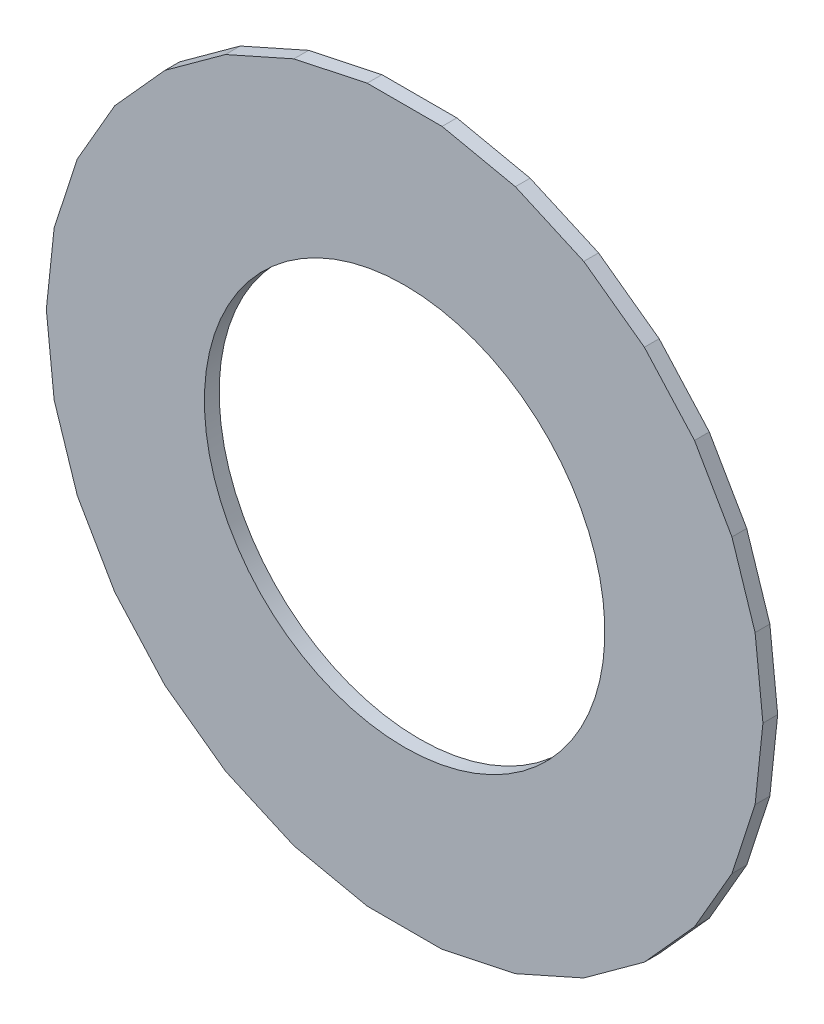
ISO-10303-21;
HEADER;
FILE_DESCRIPTION(('STEP AP214'),'2;1');
FILE_NAME('part.step','',(''),(''),'','','');
FILE_SCHEMA(('AUTOMOTIVE_DESIGN { 1 0 10303 214 1 1 1 1 }'));
ENDSEC;
DATA;
#1=APPLICATION_CONTEXT('core data for automotive mechanical design processes');
#2=APPLICATION_PROTOCOL_DEFINITION('international standard','automotive_design',2000,#1);
#3=PRODUCT_CONTEXT('',#1,'mechanical');
#4=PRODUCT('Part','Part','',(#3));
#5=PRODUCT_RELATED_PRODUCT_CATEGORY('part','',(#4));
#6=PRODUCT_DEFINITION_FORMATION('','',#4);
#7=PRODUCT_DEFINITION_CONTEXT('part definition',#1,'design');
#8=PRODUCT_DEFINITION('design','',#6,#7);
#9=PRODUCT_DEFINITION_SHAPE('','',#8);
#10=(LENGTH_UNIT() NAMED_UNIT(*) SI_UNIT(.MILLI.,.METRE.));
#11=(NAMED_UNIT(*) PLANE_ANGLE_UNIT() SI_UNIT($,.RADIAN.));
#12=(NAMED_UNIT(*) SI_UNIT($,.STERADIAN.) SOLID_ANGLE_UNIT());
#13=UNCERTAINTY_MEASURE_WITH_UNIT(LENGTH_MEASURE(1.E-05),#10,'distance_accuracy_value','');
#14=(GEOMETRIC_REPRESENTATION_CONTEXT(3) GLOBAL_UNCERTAINTY_ASSIGNED_CONTEXT((#13)) GLOBAL_UNIT_ASSIGNED_CONTEXT((#10,
#11,#12)) REPRESENTATION_CONTEXT('',''));
#15=CARTESIAN_POINT('',(0.,0.,0.));
#16=DIRECTION('',(0.,0.,1.));
#17=DIRECTION('',(1.,0.,0.));
#18=AXIS2_PLACEMENT_3D('',#15,#16,#17);
#19=CARTESIAN_POINT('',(165.24,-65.87,-0.045));
#20=DIRECTION('',(0.,0.,-1.));
#21=DIRECTION('',(0.,-1.,0.));
#22=AXIS2_PLACEMENT_3D('',#19,#20,#21);
#23=CYLINDRICAL_SURFACE('',#22,0.475);
#24=CARTESIAN_POINT('',(165.24,-65.87,1.6));
#25=DIRECTION('',(0.,0.,-1.));
#26=DIRECTION('',(0.,-1.,0.));
#27=AXIS2_PLACEMENT_3D('',#24,#25,#26);
#28=CIRCLE('',#27,0.475);
#29=CARTESIAN_POINT('',(165.24,-66.345,1.6));
#30=VERTEX_POINT('',#29);
#31=EDGE_CURVE('E290',#30,#30,#28,.T.);
#32=ORIENTED_EDGE('',*,*,#31,.T.);
#33=DIRECTION('',(0.,0.,1.));
#34=VECTOR('',#33,1.);
#35=CARTESIAN_POINT('',(165.24,-66.345,-0.045));
#36=LINE('',#35,#34);
#37=CARTESIAN_POINT('',(165.24,-66.345,1.635));
#38=VERTEX_POINT('',#37);
#39=EDGE_CURVE('E11',#30,#38,#36,.T.);
#40=ORIENTED_EDGE('',*,*,#39,.T.);
#41=CARTESIAN_POINT('',(165.24,-65.87,1.635));
#42=DIRECTION('',(0.,0.,-1.));
#43=DIRECTION('',(0.,-1.,0.));
#44=AXIS2_PLACEMENT_3D('',#41,#42,#43);
#45=CIRCLE('',#44,0.475);
#46=EDGE_CURVE('E318',#38,#38,#45,.T.);
#47=ORIENTED_EDGE('',*,*,#46,.F.);
#48=ORIENTED_EDGE('',*,*,#39,.F.);
#49=EDGE_LOOP('',(#32,#40,#47,#48));
#50=FACE_BOUND('',#49,.T.);
#51=ADVANCED_FACE('F17',(#50),#23,.F.);
#52=CARTESIAN_POINT('',(164.977336,-66.678398,1.6));
#53=DIRECTION('',(-0.406733619179909,-0.913546803961796,0.));
#54=DIRECTION('',(-0.913546803961796,0.406733619179909,0.));
#55=AXIS2_PLACEMENT_3D('',#52,#53,#54);
#56=PLANE('',#55);
#57=DIRECTION('',(0.,0.,1.));
#58=VECTOR('',#57,1.);
#59=CARTESIAN_POINT('',(164.977336,-66.678398,1.6));
#60=LINE('',#59,#58);
#61=CARTESIAN_POINT('',(164.977336,-66.678398,1.6));
#62=VERTEX_POINT('',#61);
#63=CARTESIAN_POINT('',(164.977336,-66.678398,1.635));
#64=VERTEX_POINT('',#63);
#65=EDGE_CURVE('E27',#62,#64,#60,.T.);
#66=ORIENTED_EDGE('',*,*,#65,.T.);
#67=DIRECTION('',(-0.913546803961796,0.406733619179909,0.));
#68=VECTOR('',#67,1.);
#69=CARTESIAN_POINT('',(164.977336,-66.678398,1.635));
#70=LINE('',#69,#68);
#71=CARTESIAN_POINT('',(164.815,-66.606122,1.635));
#72=VERTEX_POINT('',#71);
#73=EDGE_CURVE('E221',#64,#72,#70,.T.);
#74=ORIENTED_EDGE('',*,*,#73,.T.);
#75=DIRECTION('',(0.,0.,1.));
#76=VECTOR('',#75,1.);
#77=CARTESIAN_POINT('',(164.815,-66.606122,1.6));
#78=LINE('',#77,#76);
#79=CARTESIAN_POINT('',(164.815,-66.606122,1.6));
#80=VERTEX_POINT('',#79);
#81=EDGE_CURVE('E20',#80,#72,#78,.T.);
#82=ORIENTED_EDGE('',*,*,#81,.F.);
#83=DIRECTION('',(-0.913546803961796,0.406733619179909,0.));
#84=VECTOR('',#83,1.);
#85=CARTESIAN_POINT('',(164.977336,-66.678398,1.6));
#86=LINE('',#85,#84);
#87=EDGE_CURVE('E226',#62,#80,#86,.T.);
#88=ORIENTED_EDGE('',*,*,#87,.F.);
#89=EDGE_LOOP('',(#66,#74,#82,#88));
#90=FACE_BOUND('',#89,.T.);
#91=ADVANCED_FACE('F435',(#90),#56,.T.);
#92=CARTESIAN_POINT('',(165.151151,-66.715344,1.6));
#93=DIRECTION('',(-0.207914281899936,-0.9781470499787,0.));
#94=DIRECTION('',(-0.9781470499787,0.207914281899936,0.));
#95=AXIS2_PLACEMENT_3D('',#92,#93,#94);
#96=PLANE('',#95);
#97=DIRECTION('',(0.,0.,1.));
#98=VECTOR('',#97,1.);
#99=CARTESIAN_POINT('',(165.151151,-66.715344,1.6));
#100=LINE('',#99,#98);
#101=CARTESIAN_POINT('',(165.151151,-66.715344,1.6));
#102=VERTEX_POINT('',#101);
#103=CARTESIAN_POINT('',(165.151151,-66.715344,1.635));
#104=VERTEX_POINT('',#103);
#105=EDGE_CURVE('E406',#102,#104,#100,.T.);
#106=ORIENTED_EDGE('',*,*,#105,.T.);
#107=DIRECTION('',(-0.9781470499787,0.207914281899936,0.));
#108=VECTOR('',#107,1.);
#109=CARTESIAN_POINT('',(165.151151,-66.715344,1.635));
#110=LINE('',#109,#108);
#111=EDGE_CURVE('E240',#104,#64,#110,.T.);
#112=ORIENTED_EDGE('',*,*,#111,.T.);
#113=ORIENTED_EDGE('',*,*,#65,.F.);
#114=DIRECTION('',(-0.9781470499787,0.207914281899936,0.));
#115=VECTOR('',#114,1.);
#116=CARTESIAN_POINT('',(165.151151,-66.715344,1.6));
#117=LINE('',#116,#115);
#118=EDGE_CURVE('E211',#102,#62,#117,.T.);
#119=ORIENTED_EDGE('',*,*,#118,.F.);
#120=EDGE_LOOP('',(#106,#112,#113,#119));
#121=FACE_BOUND('',#120,.T.);
#122=ADVANCED_FACE('F1022',(#121),#96,.T.);
#123=CARTESIAN_POINT('',(164.815,-66.606122,1.6));
#124=DIRECTION('',(-0.587787166222793,-0.809015603819715,0.));
#125=DIRECTION('',(-0.809015603819715,0.587787166222793,0.));
#126=AXIS2_PLACEMENT_3D('',#123,#124,#125);
#127=PLANE('',#126);
#128=ORIENTED_EDGE('',*,*,#81,.T.);
#129=DIRECTION('',(-0.809015603819715,0.587787166222793,0.));
#130=VECTOR('',#129,1.);
#131=CARTESIAN_POINT('',(164.815,-66.606122,1.635));
#132=LINE('',#131,#130);
#133=CARTESIAN_POINT('',(164.671239,-66.501673,1.635));
#134=VERTEX_POINT('',#133);
#135=EDGE_CURVE('E217',#72,#134,#132,.T.);
#136=ORIENTED_EDGE('',*,*,#135,.T.);
#137=DIRECTION('',(0.,0.,1.));
#138=VECTOR('',#137,1.);
#139=CARTESIAN_POINT('',(164.671239,-66.501673,1.6));
#140=LINE('',#139,#138);
#141=CARTESIAN_POINT('',(164.671239,-66.501673,1.6));
#142=VERTEX_POINT('',#141);
#143=EDGE_CURVE('E403',#142,#134,#140,.T.);
#144=ORIENTED_EDGE('',*,*,#143,.F.);
#145=DIRECTION('',(-0.809015603819715,0.587787166222793,0.));
#146=VECTOR('',#145,1.);
#147=CARTESIAN_POINT('',(164.815,-66.606122,1.6));
#148=LINE('',#147,#146);
#149=EDGE_CURVE('E230',#80,#142,#148,.T.);
#150=ORIENTED_EDGE('',*,*,#149,.F.);
#151=EDGE_LOOP('',(#128,#136,#144,#150));
#152=FACE_BOUND('',#151,.T.);
#153=ADVANCED_FACE('F423',(#152),#127,.T.);
#154=CARTESIAN_POINT('',(165.328849,-66.715344,1.6));
#155=DIRECTION('',(0.,-1.,0.));
#156=DIRECTION('',(0.,0.,-1.));
#157=AXIS2_PLACEMENT_3D('',#154,#155,#156);
#158=PLANE('',#157);
#159=DIRECTION('',(0.,0.,1.));
#160=VECTOR('',#159,1.);
#161=CARTESIAN_POINT('',(165.328849,-66.715344,1.6));
#162=LINE('',#161,#160);
#163=CARTESIAN_POINT('',(165.328849,-66.715344,1.6));
#164=VERTEX_POINT('',#163);
#165=CARTESIAN_POINT('',(165.328849,-66.715344,1.635));
#166=VERTEX_POINT('',#165);
#167=EDGE_CURVE('E314',#164,#166,#162,.T.);
#168=ORIENTED_EDGE('',*,*,#167,.T.);
#169=DIRECTION('',(-1.,0.,0.));
#170=VECTOR('',#169,1.);
#171=CARTESIAN_POINT('',(165.328849,-66.715344,1.635));
#172=LINE('',#171,#170);
#173=EDGE_CURVE('E235',#166,#104,#172,.T.);
#174=ORIENTED_EDGE('',*,*,#173,.T.);
#175=ORIENTED_EDGE('',*,*,#105,.F.);
#176=DIRECTION('',(-1.,0.,0.));
#177=VECTOR('',#176,1.);
#178=CARTESIAN_POINT('',(165.328849,-66.715344,1.6));
#179=LINE('',#178,#177);
#180=EDGE_CURVE('E149',#164,#102,#179,.T.);
#181=ORIENTED_EDGE('',*,*,#180,.F.);
#182=EDGE_LOOP('',(#168,#174,#175,#181));
#183=FACE_BOUND('',#182,.T.);
#184=ADVANCED_FACE('F1102',(#183),#158,.T.);
#185=CARTESIAN_POINT('',(164.671239,-66.501673,1.6));
#186=DIRECTION('',(-0.743146942346753,-0.669128255329778,0.));
#187=DIRECTION('',(-0.669128255329778,0.743146942346753,0.));
#188=AXIS2_PLACEMENT_3D('',#185,#186,#187);
#189=PLANE('',#188);
#190=ORIENTED_EDGE('',*,*,#143,.T.);
#191=DIRECTION('',(-0.669128255329778,0.743146942346753,0.));
#192=VECTOR('',#191,1.);
#193=CARTESIAN_POINT('',(164.671239,-66.501673,1.635));
#194=LINE('',#193,#192);
#195=CARTESIAN_POINT('',(164.552336,-66.369617,1.635));
#196=VERTEX_POINT('',#195);
#197=EDGE_CURVE('E222',#134,#196,#194,.T.);
#198=ORIENTED_EDGE('',*,*,#197,.T.);
#199=DIRECTION('',(0.,0.,1.));
#200=VECTOR('',#199,1.);
#201=CARTESIAN_POINT('',(164.552336,-66.369617,1.6));
#202=LINE('',#201,#200);
#203=CARTESIAN_POINT('',(164.552336,-66.369617,1.6));
#204=VERTEX_POINT('',#203);
#205=EDGE_CURVE('E310',#204,#196,#202,.T.);
#206=ORIENTED_EDGE('',*,*,#205,.F.);
#207=DIRECTION('',(-0.669128255329778,0.743146942346753,0.));
#208=VECTOR('',#207,1.);
#209=CARTESIAN_POINT('',(164.671239,-66.501673,1.6));
#210=LINE('',#209,#208);
#211=EDGE_CURVE('E244',#142,#204,#210,.T.);
#212=ORIENTED_EDGE('',*,*,#211,.F.);
#213=EDGE_LOOP('',(#190,#198,#206,#212));
#214=FACE_BOUND('',#213,.T.);
#215=ADVANCED_FACE('F445',(#214),#189,.T.);
#216=CARTESIAN_POINT('',(165.502664,-66.678398,1.6));
#217=DIRECTION('',(0.207914281899936,-0.9781470499787,0.));
#218=DIRECTION('',(0.,0.,-1.));
#219=AXIS2_PLACEMENT_3D('',#216,#217,#218);
#220=PLANE('',#219);
#221=DIRECTION('',(0.,0.,1.));
#222=VECTOR('',#221,1.);
#223=CARTESIAN_POINT('',(165.502664,-66.678398,1.6));
#224=LINE('',#223,#222);
#225=CARTESIAN_POINT('',(165.502664,-66.678398,1.6));
#226=VERTEX_POINT('',#225);
#227=CARTESIAN_POINT('',(165.502664,-66.678398,1.635));
#228=VERTEX_POINT('',#227);
#229=EDGE_CURVE('E315',#226,#228,#224,.T.);
#230=ORIENTED_EDGE('',*,*,#229,.T.);
#231=DIRECTION('',(-0.9781470499787,-0.207914281899936,0.));
#232=VECTOR('',#231,1.);
#233=CARTESIAN_POINT('',(165.502664,-66.678398,1.635));
#234=LINE('',#233,#232);
#235=EDGE_CURVE('E239',#228,#166,#234,.T.);
#236=ORIENTED_EDGE('',*,*,#235,.T.);
#237=ORIENTED_EDGE('',*,*,#167,.F.);
#238=DIRECTION('',(-0.9781470499787,-0.207914281899936,0.));
#239=VECTOR('',#238,1.);
#240=CARTESIAN_POINT('',(165.502664,-66.678398,1.6));
#241=LINE('',#240,#239);
#242=EDGE_CURVE('E145',#226,#164,#241,.T.);
#243=ORIENTED_EDGE('',*,*,#242,.F.);
#244=EDGE_LOOP('',(#230,#236,#237,#243));
#245=FACE_BOUND('',#244,.T.);
#246=ADVANCED_FACE('F474',(#245),#220,.T.);
#247=CARTESIAN_POINT('',(164.552336,-66.369617,1.6));
#248=DIRECTION('',(-0.86602299203153,-0.500004177255306,0.));
#249=DIRECTION('',(-0.500004177255306,0.86602299203153,0.));
#250=AXIS2_PLACEMENT_3D('',#247,#248,#249);
#251=PLANE('',#250);
#252=ORIENTED_EDGE('',*,*,#205,.T.);
#253=DIRECTION('',(-0.500004177255306,0.86602299203153,0.));
#254=VECTOR('',#253,1.);
#255=CARTESIAN_POINT('',(164.552336,-66.369617,1.635));
#256=LINE('',#255,#254);
#257=CARTESIAN_POINT('',(164.463486,-66.215726,1.635));
#258=VERTEX_POINT('',#257);
#259=EDGE_CURVE('E349',#196,#258,#256,.T.);
#260=ORIENTED_EDGE('',*,*,#259,.T.);
#261=DIRECTION('',(0.,0.,1.));
#262=VECTOR('',#261,1.);
#263=CARTESIAN_POINT('',(164.463486,-66.215726,1.6));
#264=LINE('',#263,#262);
#265=CARTESIAN_POINT('',(164.463486,-66.215726,1.6));
#266=VERTEX_POINT('',#265);
#267=EDGE_CURVE('E259',#266,#258,#264,.T.);
#268=ORIENTED_EDGE('',*,*,#267,.F.);
#269=DIRECTION('',(-0.500004177255306,0.86602299203153,0.));
#270=VECTOR('',#269,1.);
#271=CARTESIAN_POINT('',(164.552336,-66.369617,1.6));
#272=LINE('',#271,#270);
#273=EDGE_CURVE('E248',#204,#266,#272,.T.);
#274=ORIENTED_EDGE('',*,*,#273,.F.);
#275=EDGE_LOOP('',(#252,#260,#268,#274));
#276=FACE_BOUND('',#275,.T.);
#277=ADVANCED_FACE('F970',(#276),#251,.T.);
#278=CARTESIAN_POINT('',(165.665,-66.606122,1.6));
#279=DIRECTION('',(0.406733619179909,-0.913546803961796,0.));
#280=DIRECTION('',(0.,0.,-1.));
#281=AXIS2_PLACEMENT_3D('',#278,#279,#280);
#282=PLANE('',#281);
#283=DIRECTION('',(0.,0.,1.));
#284=VECTOR('',#283,1.);
#285=CARTESIAN_POINT('',(165.665,-66.606122,1.6));
#286=LINE('',#285,#284);
#287=CARTESIAN_POINT('',(165.665,-66.606122,1.6));
#288=VERTEX_POINT('',#287);
#289=CARTESIAN_POINT('',(165.665,-66.606122,1.635));
#290=VERTEX_POINT('',#289);
#291=EDGE_CURVE('E132',#288,#290,#286,.T.);
#292=ORIENTED_EDGE('',*,*,#291,.T.);
#293=DIRECTION('',(-0.913546803961796,-0.406733619179909,0.));
#294=VECTOR('',#293,1.);
#295=CARTESIAN_POINT('',(165.665,-66.606122,1.635));
#296=LINE('',#295,#294);
#297=EDGE_CURVE('E370',#290,#228,#296,.T.);
#298=ORIENTED_EDGE('',*,*,#297,.T.);
#299=ORIENTED_EDGE('',*,*,#229,.F.);
#300=DIRECTION('',(-0.913546803961796,-0.406733619179909,0.));
#301=VECTOR('',#300,1.);
#302=CARTESIAN_POINT('',(165.665,-66.606122,1.6));
#303=LINE('',#302,#301);
#304=EDGE_CURVE('E150',#288,#226,#303,.T.);
#305=ORIENTED_EDGE('',*,*,#304,.F.);
#306=EDGE_LOOP('',(#292,#298,#299,#305));
#307=FACE_BOUND('',#306,.T.);
#308=ADVANCED_FACE('F481',(#307),#282,.T.);
#309=CARTESIAN_POINT('',(164.463486,-66.215726,1.6));
#310=DIRECTION('',(-0.951057762630114,-0.309013158524037,0.));
#311=DIRECTION('',(-0.309013158524037,0.951057762630114,0.));
#312=AXIS2_PLACEMENT_3D('',#309,#310,#311);
#313=PLANE('',#312);
#314=ORIENTED_EDGE('',*,*,#267,.T.);
#315=DIRECTION('',(-0.309013158524037,0.951057762630114,0.));
#316=VECTOR('',#315,1.);
#317=CARTESIAN_POINT('',(164.463486,-66.215726,1.635));
#318=LINE('',#317,#316);
#319=CARTESIAN_POINT('',(164.408575,-66.046725,1.635));
#320=VERTEX_POINT('',#319);
#321=EDGE_CURVE('E345',#258,#320,#318,.T.);
#322=ORIENTED_EDGE('',*,*,#321,.T.);
#323=DIRECTION('',(0.,0.,1.));
#324=VECTOR('',#323,1.);
#325=CARTESIAN_POINT('',(164.408575,-66.046725,1.6));
#326=LINE('',#325,#324);
#327=CARTESIAN_POINT('',(164.408575,-66.046725,1.6));
#328=VERTEX_POINT('',#327);
#329=EDGE_CURVE('E128',#328,#320,#326,.T.);
#330=ORIENTED_EDGE('',*,*,#329,.F.);
#331=DIRECTION('',(-0.309013158524037,0.951057762630114,0.));
#332=VECTOR('',#331,1.);
#333=CARTESIAN_POINT('',(164.463486,-66.215726,1.6));
#334=LINE('',#333,#332);
#335=EDGE_CURVE('E252',#266,#328,#334,.T.);
#336=ORIENTED_EDGE('',*,*,#335,.F.);
#337=EDGE_LOOP('',(#314,#322,#330,#336));
#338=FACE_BOUND('',#337,.T.);
#339=ADVANCED_FACE('F683',(#338),#313,.T.);
#340=CARTESIAN_POINT('',(165.808761,-66.501673,1.6));
#341=DIRECTION('',(0.587787166222793,-0.809015603819715,0.));
#342=DIRECTION('',(0.,0.,-1.));
#343=AXIS2_PLACEMENT_3D('',#340,#341,#342);
#344=PLANE('',#343);
#345=DIRECTION('',(0.,0.,1.));
#346=VECTOR('',#345,1.);
#347=CARTESIAN_POINT('',(165.808761,-66.501673,1.6));
#348=LINE('',#347,#346);
#349=CARTESIAN_POINT('',(165.808761,-66.501673,1.6));
#350=VERTEX_POINT('',#349);
#351=CARTESIAN_POINT('',(165.808761,-66.501673,1.635));
#352=VERTEX_POINT('',#351);
#353=EDGE_CURVE('E133',#350,#352,#348,.T.);
#354=ORIENTED_EDGE('',*,*,#353,.T.);
#355=DIRECTION('',(-0.809015603819715,-0.587787166222793,0.));
#356=VECTOR('',#355,1.);
#357=CARTESIAN_POINT('',(165.808761,-66.501673,1.635));
#358=LINE('',#357,#356);
#359=EDGE_CURVE('E341',#352,#290,#358,.T.);
#360=ORIENTED_EDGE('',*,*,#359,.T.);
#361=ORIENTED_EDGE('',*,*,#291,.F.);
#362=DIRECTION('',(-0.809015603819715,-0.587787166222793,0.));
#363=VECTOR('',#362,1.);
#364=CARTESIAN_POINT('',(165.808761,-66.501673,1.6));
#365=LINE('',#364,#363);
#366=EDGE_CURVE('E196',#350,#288,#365,.T.);
#367=ORIENTED_EDGE('',*,*,#366,.F.);
#368=EDGE_LOOP('',(#354,#360,#361,#367));
#369=FACE_BOUND('',#368,.T.);
#370=ADVANCED_FACE('F706',(#369),#344,.T.);
#371=CARTESIAN_POINT('',(164.408575,-66.046725,1.6));
#372=DIRECTION('',(-0.994521629756077,-0.104530990368008,0.));
#373=DIRECTION('',(-0.104530990368008,0.994521629756077,0.));
#374=AXIS2_PLACEMENT_3D('',#371,#372,#373);
#375=PLANE('',#374);
#376=ORIENTED_EDGE('',*,*,#329,.T.);
#377=DIRECTION('',(-0.104530990368008,0.994521629756077,0.));
#378=VECTOR('',#377,1.);
#379=CARTESIAN_POINT('',(164.408575,-66.046725,1.635));
#380=LINE('',#379,#378);
#381=CARTESIAN_POINT('',(164.39,-65.87,1.635));
#382=VERTEX_POINT('',#381);
#383=EDGE_CURVE('E331',#320,#382,#380,.T.);
#384=ORIENTED_EDGE('',*,*,#383,.T.);
#385=DIRECTION('',(0.,0.,1.));
#386=VECTOR('',#385,1.);
#387=CARTESIAN_POINT('',(164.39,-65.87,1.6));
#388=LINE('',#387,#386);
#389=CARTESIAN_POINT('',(164.39,-65.87,1.6));
#390=VERTEX_POINT('',#389);
#391=EDGE_CURVE('E334',#390,#382,#388,.T.);
#392=ORIENTED_EDGE('',*,*,#391,.F.);
#393=DIRECTION('',(-0.104530990368008,0.994521629756077,0.));
#394=VECTOR('',#393,1.);
#395=CARTESIAN_POINT('',(164.408575,-66.046725,1.6));
#396=LINE('',#395,#394);
#397=EDGE_CURVE('E256',#328,#390,#396,.T.);
#398=ORIENTED_EDGE('',*,*,#397,.F.);
#399=EDGE_LOOP('',(#376,#384,#392,#398));
#400=FACE_BOUND('',#399,.T.);
#401=ADVANCED_FACE('F678',(#400),#375,.T.);
#402=CARTESIAN_POINT('',(165.927664,-66.369617,1.6));
#403=DIRECTION('',(0.743146942346753,-0.669128255329778,0.));
#404=DIRECTION('',(0.,0.,-1.));
#405=AXIS2_PLACEMENT_3D('',#402,#403,#404);
#406=PLANE('',#405);
#407=DIRECTION('',(0.,0.,1.));
#408=VECTOR('',#407,1.);
#409=CARTESIAN_POINT('',(165.927664,-66.369617,1.6));
#410=LINE('',#409,#408);
#411=CARTESIAN_POINT('',(165.927664,-66.369617,1.6));
#412=VERTEX_POINT('',#411);
#413=CARTESIAN_POINT('',(165.927664,-66.369617,1.635));
#414=VERTEX_POINT('',#413);
#415=EDGE_CURVE('E184',#412,#414,#410,.T.);
#416=ORIENTED_EDGE('',*,*,#415,.T.);
#417=DIRECTION('',(-0.669128255329778,-0.743146942346753,0.));
#418=VECTOR('',#417,1.);
#419=CARTESIAN_POINT('',(165.927664,-66.369617,1.635));
#420=LINE('',#419,#418);
#421=EDGE_CURVE('E144',#414,#352,#420,.T.);
#422=ORIENTED_EDGE('',*,*,#421,.T.);
#423=ORIENTED_EDGE('',*,*,#353,.F.);
#424=DIRECTION('',(-0.669128255329778,-0.743146942346753,0.));
#425=VECTOR('',#424,1.);
#426=CARTESIAN_POINT('',(165.927664,-66.369617,1.6));
#427=LINE('',#426,#425);
#428=EDGE_CURVE('E179',#412,#350,#427,.T.);
#429=ORIENTED_EDGE('',*,*,#428,.F.);
#430=EDGE_LOOP('',(#416,#422,#423,#429));
#431=FACE_BOUND('',#430,.T.);
#432=ADVANCED_FACE('F703',(#431),#406,.T.);
#433=CARTESIAN_POINT('',(164.39,-65.87,1.6));
#434=DIRECTION('',(-0.994521629756077,0.104530990368008,0.));
#435=DIRECTION('',(0.,0.,1.));
#436=AXIS2_PLACEMENT_3D('',#433,#434,#435);
#437=PLANE('',#436);
#438=ORIENTED_EDGE('',*,*,#391,.T.);
#439=DIRECTION('',(0.104530990368008,0.994521629756077,0.));
#440=VECTOR('',#439,1.);
#441=CARTESIAN_POINT('',(164.39,-65.87,1.635));
#442=LINE('',#441,#440);
#443=CARTESIAN_POINT('',(164.408575,-65.693275,1.635));
#444=VERTEX_POINT('',#443);
#445=EDGE_CURVE('E269',#382,#444,#442,.T.);
#446=ORIENTED_EDGE('',*,*,#445,.T.);
#447=DIRECTION('',(0.,0.,1.));
#448=VECTOR('',#447,1.);
#449=CARTESIAN_POINT('',(164.408575,-65.693275,1.6));
#450=LINE('',#449,#448);
#451=CARTESIAN_POINT('',(164.408575,-65.693275,1.6));
#452=VERTEX_POINT('',#451);
#453=EDGE_CURVE('E180',#452,#444,#450,.T.);
#454=ORIENTED_EDGE('',*,*,#453,.F.);
#455=DIRECTION('',(0.104530990368008,0.994521629756077,0.));
#456=VECTOR('',#455,1.);
#457=CARTESIAN_POINT('',(164.39,-65.87,1.6));
#458=LINE('',#457,#456);
#459=EDGE_CURVE('E260',#390,#452,#458,.T.);
#460=ORIENTED_EDGE('',*,*,#459,.F.);
#461=EDGE_LOOP('',(#438,#446,#454,#460));
#462=FACE_BOUND('',#461,.T.);
#463=ADVANCED_FACE('F688',(#462),#437,.T.);
#464=CARTESIAN_POINT('',(166.016514,-66.215726,1.6));
#465=DIRECTION('',(0.86602299203153,-0.500004177255306,0.));
#466=DIRECTION('',(0.,0.,-1.));
#467=AXIS2_PLACEMENT_3D('',#464,#465,#466);
#468=PLANE('',#467);
#469=DIRECTION('',(0.,0.,1.));
#470=VECTOR('',#469,1.);
#471=CARTESIAN_POINT('',(166.016514,-66.215726,1.6));
#472=LINE('',#471,#470);
#473=CARTESIAN_POINT('',(166.016514,-66.215726,1.6));
#474=VERTEX_POINT('',#473);
#475=CARTESIAN_POINT('',(166.016514,-66.215726,1.635));
#476=VERTEX_POINT('',#475);
#477=EDGE_CURVE('E185',#474,#476,#472,.T.);
#478=ORIENTED_EDGE('',*,*,#477,.T.);
#479=DIRECTION('',(-0.500004177255306,-0.86602299203153,0.));
#480=VECTOR('',#479,1.);
#481=CARTESIAN_POINT('',(166.016514,-66.215726,1.635));
#482=LINE('',#481,#480);
#483=EDGE_CURVE('E139',#476,#414,#482,.T.);
#484=ORIENTED_EDGE('',*,*,#483,.T.);
#485=ORIENTED_EDGE('',*,*,#415,.F.);
#486=DIRECTION('',(-0.500004177255306,-0.86602299203153,0.));
#487=VECTOR('',#486,1.);
#488=CARTESIAN_POINT('',(166.016514,-66.215726,1.6));
#489=LINE('',#488,#487);
#490=EDGE_CURVE('E174',#474,#412,#489,.T.);
#491=ORIENTED_EDGE('',*,*,#490,.F.);
#492=EDGE_LOOP('',(#478,#484,#485,#491));
#493=FACE_BOUND('',#492,.T.);
#494=ADVANCED_FACE('F710',(#493),#468,.T.);
#495=CARTESIAN_POINT('',(164.408575,-65.693275,1.6));
#496=DIRECTION('',(-0.951057762630114,0.309013158524037,0.));
#497=DIRECTION('',(0.,0.,1.));
#498=AXIS2_PLACEMENT_3D('',#495,#496,#497);
#499=PLANE('',#498);
#500=ORIENTED_EDGE('',*,*,#453,.T.);
#501=DIRECTION('',(0.309013158524037,0.951057762630114,0.));
#502=VECTOR('',#501,1.);
#503=CARTESIAN_POINT('',(164.408575,-65.693275,1.635));
#504=LINE('',#503,#502);
#505=CARTESIAN_POINT('',(164.463486,-65.524274,1.635));
#506=VERTEX_POINT('',#505);
#507=EDGE_CURVE('E265',#444,#506,#504,.T.);
#508=ORIENTED_EDGE('',*,*,#507,.T.);
#509=DIRECTION('',(0.,0.,1.));
#510=VECTOR('',#509,1.);
#511=CARTESIAN_POINT('',(164.463486,-65.524274,1.6));
#512=LINE('',#511,#510);
#513=CARTESIAN_POINT('',(164.463486,-65.524274,1.6));
#514=VERTEX_POINT('',#513);
#515=EDGE_CURVE('E360',#514,#506,#512,.T.);
#516=ORIENTED_EDGE('',*,*,#515,.F.);
#517=DIRECTION('',(0.309013158524037,0.951057762630114,0.));
#518=VECTOR('',#517,1.);
#519=CARTESIAN_POINT('',(164.408575,-65.693275,1.6));
#520=LINE('',#519,#518);
#521=EDGE_CURVE('E264',#452,#514,#520,.T.);
#522=ORIENTED_EDGE('',*,*,#521,.F.);
#523=EDGE_LOOP('',(#500,#508,#516,#522));
#524=FACE_BOUND('',#523,.T.);
#525=ADVANCED_FACE('F1067',(#524),#499,.T.);
#526=CARTESIAN_POINT('',(166.071425,-66.046725,1.6));
#527=DIRECTION('',(0.951057762630114,-0.309013158524037,0.));
#528=DIRECTION('',(0.,0.,-1.));
#529=AXIS2_PLACEMENT_3D('',#526,#527,#528);
#530=PLANE('',#529);
#531=DIRECTION('',(0.,0.,1.));
#532=VECTOR('',#531,1.);
#533=CARTESIAN_POINT('',(166.071425,-66.046725,1.6));
#534=LINE('',#533,#532);
#535=CARTESIAN_POINT('',(166.071425,-66.046725,1.6));
#536=VERTEX_POINT('',#535);
#537=CARTESIAN_POINT('',(166.071425,-66.046725,1.635));
#538=VERTEX_POINT('',#537);
#539=EDGE_CURVE('E234',#536,#538,#534,.T.);
#540=ORIENTED_EDGE('',*,*,#539,.T.);
#541=DIRECTION('',(-0.309013158524037,-0.951057762630114,0.));
#542=VECTOR('',#541,1.);
#543=CARTESIAN_POINT('',(166.071425,-66.046725,1.635));
#544=LINE('',#543,#542);
#545=EDGE_CURVE('E143',#538,#476,#544,.T.);
#546=ORIENTED_EDGE('',*,*,#545,.T.);
#547=ORIENTED_EDGE('',*,*,#477,.F.);
#548=DIRECTION('',(-0.309013158524037,-0.951057762630114,0.));
#549=VECTOR('',#548,1.);
#550=CARTESIAN_POINT('',(166.071425,-66.046725,1.6));
#551=LINE('',#550,#549);
#552=EDGE_CURVE('E170',#536,#474,#551,.T.);
#553=ORIENTED_EDGE('',*,*,#552,.F.);
#554=EDGE_LOOP('',(#540,#546,#547,#553));
#555=FACE_BOUND('',#554,.T.);
#556=ADVANCED_FACE('F714',(#555),#530,.T.);
#557=CARTESIAN_POINT('',(164.463486,-65.524274,1.6));
#558=DIRECTION('',(-0.86602299203153,0.500004177255306,0.));
#559=DIRECTION('',(0.,0.,1.));
#560=AXIS2_PLACEMENT_3D('',#557,#558,#559);
#561=PLANE('',#560);
#562=ORIENTED_EDGE('',*,*,#515,.T.);
#563=DIRECTION('',(0.500004177255306,0.86602299203153,0.));
#564=VECTOR('',#563,1.);
#565=CARTESIAN_POINT('',(164.463486,-65.524274,1.635));
#566=LINE('',#565,#564);
#567=CARTESIAN_POINT('',(164.552336,-65.370383,1.635));
#568=VERTEX_POINT('',#567);
#569=EDGE_CURVE('E270',#506,#568,#566,.T.);
#570=ORIENTED_EDGE('',*,*,#569,.T.);
#571=DIRECTION('',(0.,0.,1.));
#572=VECTOR('',#571,1.);
#573=CARTESIAN_POINT('',(164.552336,-65.370383,1.6));
#574=LINE('',#573,#572);
#575=CARTESIAN_POINT('',(164.552336,-65.370383,1.6));
#576=VERTEX_POINT('',#575);
#577=EDGE_CURVE('E216',#576,#568,#574,.T.);
#578=ORIENTED_EDGE('',*,*,#577,.F.);
#579=DIRECTION('',(0.500004177255306,0.86602299203153,0.));
#580=VECTOR('',#579,1.);
#581=CARTESIAN_POINT('',(164.463486,-65.524274,1.6));
#582=LINE('',#581,#580);
#583=EDGE_CURVE('E204',#514,#576,#582,.T.);
#584=ORIENTED_EDGE('',*,*,#583,.F.);
#585=EDGE_LOOP('',(#562,#570,#578,#584));
#586=FACE_BOUND('',#585,.T.);
#587=ADVANCED_FACE('F1042',(#586),#561,.T.);
#588=CARTESIAN_POINT('',(166.09,-65.87,1.6));
#589=DIRECTION('',(0.994521629756077,-0.104530990368008,0.));
#590=DIRECTION('',(0.,0.,-1.));
#591=AXIS2_PLACEMENT_3D('',#588,#589,#590);
#592=PLANE('',#591);
#593=DIRECTION('',(0.,0.,1.));
#594=VECTOR('',#593,1.);
#595=CARTESIAN_POINT('',(166.09,-65.87,1.6));
#596=LINE('',#595,#594);
#597=CARTESIAN_POINT('',(166.09,-65.87,1.6));
#598=VERTEX_POINT('',#597);
#599=CARTESIAN_POINT('',(166.09,-65.87,1.635));
#600=VERTEX_POINT('',#599);
#601=EDGE_CURVE('E212',#598,#600,#596,.T.);
#602=ORIENTED_EDGE('',*,*,#601,.T.);
#603=DIRECTION('',(-0.104530990368008,-0.994521629756077,0.));
#604=VECTOR('',#603,1.);
#605=CARTESIAN_POINT('',(166.09,-65.87,1.635));
#606=LINE('',#605,#604);
#607=EDGE_CURVE('E116',#600,#538,#606,.T.);
#608=ORIENTED_EDGE('',*,*,#607,.T.);
#609=ORIENTED_EDGE('',*,*,#539,.F.);
#610=DIRECTION('',(-0.104530990368008,-0.994521629756077,0.));
#611=VECTOR('',#610,1.);
#612=CARTESIAN_POINT('',(166.09,-65.87,1.6));
#613=LINE('',#612,#611);
#614=EDGE_CURVE('E175',#598,#536,#613,.T.);
#615=ORIENTED_EDGE('',*,*,#614,.F.);
#616=EDGE_LOOP('',(#602,#608,#609,#615));
#617=FACE_BOUND('',#616,.T.);
#618=ADVANCED_FACE('F717',(#617),#592,.T.);
#619=CARTESIAN_POINT('',(164.552336,-65.370383,1.6));
#620=DIRECTION('',(-0.743146942346753,0.669128255329778,0.));
#621=DIRECTION('',(0.,0.,1.));
#622=AXIS2_PLACEMENT_3D('',#619,#620,#621);
#623=PLANE('',#622);
#624=ORIENTED_EDGE('',*,*,#577,.T.);
#625=DIRECTION('',(0.669128255329778,0.743146942346753,0.));
#626=VECTOR('',#625,1.);
#627=CARTESIAN_POINT('',(164.552336,-65.370383,1.635));
#628=LINE('',#627,#626);
#629=CARTESIAN_POINT('',(164.671239,-65.238327,1.635));
#630=VERTEX_POINT('',#629);
#631=EDGE_CURVE('E309',#568,#630,#628,.T.);
#632=ORIENTED_EDGE('',*,*,#631,.T.);
#633=DIRECTION('',(0.,0.,1.));
#634=VECTOR('',#633,1.);
#635=CARTESIAN_POINT('',(164.671239,-65.238327,1.6));
#636=LINE('',#635,#634);
#637=CARTESIAN_POINT('',(164.671239,-65.238327,1.6));
#638=VERTEX_POINT('',#637);
#639=EDGE_CURVE('E189',#638,#630,#636,.T.);
#640=ORIENTED_EDGE('',*,*,#639,.F.);
#641=DIRECTION('',(0.669128255329778,0.743146942346753,0.));
#642=VECTOR('',#641,1.);
#643=CARTESIAN_POINT('',(164.552336,-65.370383,1.6));
#644=LINE('',#643,#642);
#645=EDGE_CURVE('E200',#576,#638,#644,.T.);
#646=ORIENTED_EDGE('',*,*,#645,.F.);
#647=EDGE_LOOP('',(#624,#632,#640,#646));
#648=FACE_BOUND('',#647,.T.);
#649=ADVANCED_FACE('F925',(#648),#623,.T.);
#650=CARTESIAN_POINT('',(166.071425,-65.693275,1.6));
#651=DIRECTION('',(0.994521629756077,0.104530990368008,0.));
#652=DIRECTION('',(0.,0.,-1.));
#653=AXIS2_PLACEMENT_3D('',#650,#651,#652);
#654=PLANE('',#653);
#655=DIRECTION('',(0.,0.,1.));
#656=VECTOR('',#655,1.);
#657=CARTESIAN_POINT('',(166.071425,-65.693275,1.6));
#658=LINE('',#657,#656);
#659=CARTESIAN_POINT('',(166.071425,-65.693275,1.6));
#660=VERTEX_POINT('',#659);
#661=CARTESIAN_POINT('',(166.071425,-65.693275,1.635));
#662=VERTEX_POINT('',#661);
#663=EDGE_CURVE('E186',#660,#662,#658,.T.);
#664=ORIENTED_EDGE('',*,*,#663,.T.);
#665=DIRECTION('',(0.104530990368008,-0.994521629756077,0.));
#666=VECTOR('',#665,1.);
#667=CARTESIAN_POINT('',(166.071425,-65.693275,1.635));
#668=LINE('',#667,#666);
#669=EDGE_CURVE('E109',#662,#600,#668,.T.);
#670=ORIENTED_EDGE('',*,*,#669,.T.);
#671=ORIENTED_EDGE('',*,*,#601,.F.);
#672=DIRECTION('',(0.104530990368008,-0.994521629756077,0.));
#673=VECTOR('',#672,1.);
#674=CARTESIAN_POINT('',(166.071425,-65.693275,1.6));
#675=LINE('',#674,#673);
#676=EDGE_CURVE('E493',#660,#598,#675,.T.);
#677=ORIENTED_EDGE('',*,*,#676,.F.);
#678=EDGE_LOOP('',(#664,#670,#671,#677));
#679=FACE_BOUND('',#678,.T.);
#680=ADVANCED_FACE('F720',(#679),#654,.T.);
#681=CARTESIAN_POINT('',(164.671239,-65.238327,1.6));
#682=DIRECTION('',(-0.587787166222793,0.809015603819715,0.));
#683=DIRECTION('',(0.,0.,1.));
#684=AXIS2_PLACEMENT_3D('',#681,#682,#683);
#685=PLANE('',#684);
#686=ORIENTED_EDGE('',*,*,#639,.T.);
#687=DIRECTION('',(0.809015603819715,0.587787166222793,0.));
#688=VECTOR('',#687,1.);
#689=CARTESIAN_POINT('',(164.671239,-65.238327,1.635));
#690=LINE('',#689,#688);
#691=CARTESIAN_POINT('',(164.815,-65.133878,1.635));
#692=VERTEX_POINT('',#691);
#693=EDGE_CURVE('E305',#630,#692,#690,.T.);
#694=ORIENTED_EDGE('',*,*,#693,.T.);
#695=DIRECTION('',(0.,0.,1.));
#696=VECTOR('',#695,1.);
#697=CARTESIAN_POINT('',(164.815,-65.133878,1.6));
#698=LINE('',#697,#696);
#699=CARTESIAN_POINT('',(164.815,-65.133878,1.6));
#700=VERTEX_POINT('',#699);
#701=EDGE_CURVE('E91',#700,#692,#698,.T.);
#702=ORIENTED_EDGE('',*,*,#701,.F.);
#703=DIRECTION('',(0.809015603819715,0.587787166222793,0.));
#704=VECTOR('',#703,1.);
#705=CARTESIAN_POINT('',(164.671239,-65.238327,1.6));
#706=LINE('',#705,#704);
#707=EDGE_CURVE('E195',#638,#700,#706,.T.);
#708=ORIENTED_EDGE('',*,*,#707,.F.);
#709=EDGE_LOOP('',(#686,#694,#702,#708));
#710=FACE_BOUND('',#709,.T.);
#711=ADVANCED_FACE('F988',(#710),#685,.T.);
#712=CARTESIAN_POINT('',(166.016514,-65.524274,1.6));
#713=DIRECTION('',(0.951057762630114,0.309013158524037,0.));
#714=DIRECTION('',(0.,0.,-1.));
#715=AXIS2_PLACEMENT_3D('',#712,#713,#714);
#716=PLANE('',#715);
#717=DIRECTION('',(0.,0.,1.));
#718=VECTOR('',#717,1.);
#719=CARTESIAN_POINT('',(166.016514,-65.524274,1.6));
#720=LINE('',#719,#718);
#721=CARTESIAN_POINT('',(166.016514,-65.524274,1.6));
#722=VERTEX_POINT('',#721);
#723=CARTESIAN_POINT('',(166.016514,-65.524274,1.635));
#724=VERTEX_POINT('',#723);
#725=EDGE_CURVE('E77',#722,#724,#720,.T.);
#726=ORIENTED_EDGE('',*,*,#725,.T.);
#727=DIRECTION('',(0.309013158524037,-0.951057762630114,0.));
#728=VECTOR('',#727,1.);
#729=CARTESIAN_POINT('',(166.016514,-65.524274,1.635));
#730=LINE('',#729,#728);
#731=EDGE_CURVE('E82',#724,#662,#730,.T.);
#732=ORIENTED_EDGE('',*,*,#731,.T.);
#733=ORIENTED_EDGE('',*,*,#663,.F.);
#734=DIRECTION('',(0.309013158524037,-0.951057762630114,0.));
#735=VECTOR('',#734,1.);
#736=CARTESIAN_POINT('',(166.016514,-65.524274,1.6));
#737=LINE('',#736,#735);
#738=EDGE_CURVE('E86',#722,#660,#737,.T.);
#739=ORIENTED_EDGE('',*,*,#738,.F.);
#740=EDGE_LOOP('',(#726,#732,#733,#739));
#741=FACE_BOUND('',#740,.T.);
#742=ADVANCED_FACE('F79',(#741),#716,.T.);
#743=CARTESIAN_POINT('',(164.815,-65.133878,1.6));
#744=DIRECTION('',(-0.406733619179909,0.913546803961796,0.));
#745=DIRECTION('',(0.,0.,1.));
#746=AXIS2_PLACEMENT_3D('',#743,#744,#745);
#747=PLANE('',#746);
#748=ORIENTED_EDGE('',*,*,#701,.T.);
#749=DIRECTION('',(0.913546803961796,0.406733619179909,0.));
#750=VECTOR('',#749,1.);
#751=CARTESIAN_POINT('',(164.815,-65.133878,1.635));
#752=LINE('',#751,#750);
#753=CARTESIAN_POINT('',(164.977336,-65.061602,1.635));
#754=VERTEX_POINT('',#753);
#755=EDGE_CURVE('E301',#692,#754,#752,.T.);
#756=ORIENTED_EDGE('',*,*,#755,.T.);
#757=DIRECTION('',(0.,0.,1.));
#758=VECTOR('',#757,1.);
#759=CARTESIAN_POINT('',(164.977336,-65.061602,1.6));
#760=LINE('',#759,#758);
#761=CARTESIAN_POINT('',(164.977336,-65.061602,1.6));
#762=VERTEX_POINT('',#761);
#763=EDGE_CURVE('E92',#762,#754,#760,.T.);
#764=ORIENTED_EDGE('',*,*,#763,.F.);
#765=DIRECTION('',(0.913546803961796,0.406733619179909,0.));
#766=VECTOR('',#765,1.);
#767=CARTESIAN_POINT('',(164.815,-65.133878,1.6));
#768=LINE('',#767,#766);
#769=EDGE_CURVE('E190',#700,#762,#768,.T.);
#770=ORIENTED_EDGE('',*,*,#769,.F.);
#771=EDGE_LOOP('',(#748,#756,#764,#770));
#772=FACE_BOUND('',#771,.T.);
#773=ADVANCED_FACE('F919',(#772),#747,.T.);
#774=CARTESIAN_POINT('',(165.927664,-65.370383,1.6));
#775=DIRECTION('',(0.86602299203153,0.500004177255306,0.));
#776=DIRECTION('',(0.,0.,-1.));
#777=AXIS2_PLACEMENT_3D('',#774,#775,#776);
#778=PLANE('',#777);
#779=DIRECTION('',(0.,0.,1.));
#780=VECTOR('',#779,1.);
#781=CARTESIAN_POINT('',(165.927664,-65.370383,1.6));
#782=LINE('',#781,#780);
#783=CARTESIAN_POINT('',(165.927664,-65.370383,1.6));
#784=VERTEX_POINT('',#783);
#785=CARTESIAN_POINT('',(165.927664,-65.370383,1.635));
#786=VERTEX_POINT('',#785);
#787=EDGE_CURVE('E98',#784,#786,#782,.T.);
#788=ORIENTED_EDGE('',*,*,#787,.T.);
#789=DIRECTION('',(0.500004177255306,-0.86602299203153,0.));
#790=VECTOR('',#789,1.);
#791=CARTESIAN_POINT('',(165.927664,-65.370383,1.635));
#792=LINE('',#791,#790);
#793=EDGE_CURVE('E95',#786,#724,#792,.T.);
#794=ORIENTED_EDGE('',*,*,#793,.T.);
#795=ORIENTED_EDGE('',*,*,#725,.F.);
#796=DIRECTION('',(0.500004177255306,-0.86602299203153,0.));
#797=VECTOR('',#796,1.);
#798=CARTESIAN_POINT('',(165.927664,-65.370383,1.6));
#799=LINE('',#798,#797);
#800=EDGE_CURVE('E120',#784,#722,#799,.T.);
#801=ORIENTED_EDGE('',*,*,#800,.F.);
#802=EDGE_LOOP('',(#788,#794,#795,#801));
#803=FACE_BOUND('',#802,.T.);
#804=ADVANCED_FACE('F96',(#803),#778,.T.);
#805=CARTESIAN_POINT('',(164.977336,-65.061602,1.6));
#806=DIRECTION('',(-0.207914281899936,0.9781470499787,0.));
#807=DIRECTION('',(0.,0.,1.));
#808=AXIS2_PLACEMENT_3D('',#805,#806,#807);
#809=PLANE('',#808);
#810=ORIENTED_EDGE('',*,*,#763,.T.);
#811=DIRECTION('',(0.9781470499787,0.207914281899936,0.));
#812=VECTOR('',#811,1.);
#813=CARTESIAN_POINT('',(164.977336,-65.061602,1.635));
#814=LINE('',#813,#812);
#815=CARTESIAN_POINT('',(165.151151,-65.024656,1.635));
#816=VERTEX_POINT('',#815);
#817=EDGE_CURVE('E296',#754,#816,#814,.T.);
#818=ORIENTED_EDGE('',*,*,#817,.T.);
#819=DIRECTION('',(0.,0.,1.));
#820=VECTOR('',#819,1.);
#821=CARTESIAN_POINT('',(165.151151,-65.024656,1.6));
#822=LINE('',#821,#820);
#823=CARTESIAN_POINT('',(165.151151,-65.024656,1.6));
#824=VERTEX_POINT('',#823);
#825=EDGE_CURVE('E379',#824,#816,#822,.T.);
#826=ORIENTED_EDGE('',*,*,#825,.F.);
#827=DIRECTION('',(0.9781470499787,0.207914281899936,0.));
#828=VECTOR('',#827,1.);
#829=CARTESIAN_POINT('',(164.977336,-65.061602,1.6));
#830=LINE('',#829,#828);
#831=EDGE_CURVE('E194',#762,#824,#830,.T.);
#832=ORIENTED_EDGE('',*,*,#831,.F.);
#833=EDGE_LOOP('',(#810,#818,#826,#832));
#834=FACE_BOUND('',#833,.T.);
#835=ADVANCED_FACE('F918',(#834),#809,.T.);
#836=CARTESIAN_POINT('',(165.808761,-65.238327,1.6));
#837=DIRECTION('',(0.743146942346753,0.669128255329778,0.));
#838=DIRECTION('',(0.,0.,-1.));
#839=AXIS2_PLACEMENT_3D('',#836,#837,#838);
#840=PLANE('',#839);
#841=DIRECTION('',(0.,0.,1.));
#842=VECTOR('',#841,1.);
#843=CARTESIAN_POINT('',(165.808761,-65.238327,1.6));
#844=LINE('',#843,#842);
#845=CARTESIAN_POINT('',(165.808761,-65.238327,1.6));
#846=VERTEX_POINT('',#845);
#847=CARTESIAN_POINT('',(165.808761,-65.238327,1.635));
#848=VERTEX_POINT('',#847);
#849=EDGE_CURVE('E155',#846,#848,#844,.T.);
#850=ORIENTED_EDGE('',*,*,#849,.T.);
#851=DIRECTION('',(0.669128255329778,-0.743146942346753,0.));
#852=VECTOR('',#851,1.);
#853=CARTESIAN_POINT('',(165.808761,-65.238327,1.635));
#854=LINE('',#853,#852);
#855=EDGE_CURVE('E103',#848,#786,#854,.T.);
#856=ORIENTED_EDGE('',*,*,#855,.T.);
#857=ORIENTED_EDGE('',*,*,#787,.F.);
#858=DIRECTION('',(0.669128255329778,-0.743146942346753,0.));
#859=VECTOR('',#858,1.);
#860=CARTESIAN_POINT('',(165.808761,-65.238327,1.6));
#861=LINE('',#860,#859);
#862=EDGE_CURVE('E166',#846,#784,#861,.T.);
#863=ORIENTED_EDGE('',*,*,#862,.F.);
#864=EDGE_LOOP('',(#850,#856,#857,#863));
#865=FACE_BOUND('',#864,.T.);
#866=ADVANCED_FACE('F996',(#865),#840,.T.);
#867=CARTESIAN_POINT('',(165.151151,-65.024656,1.6));
#868=DIRECTION('',(0.,1.,0.));
#869=DIRECTION('',(1.,0.,0.));
#870=AXIS2_PLACEMENT_3D('',#867,#868,#869);
#871=PLANE('',#870);
#872=ORIENTED_EDGE('',*,*,#825,.T.);
#873=DIRECTION('',(1.,0.,0.));
#874=VECTOR('',#873,1.);
#875=CARTESIAN_POINT('',(165.151151,-65.024656,1.635));
#876=LINE('',#875,#874);
#877=CARTESIAN_POINT('',(165.328849,-65.024656,1.635));
#878=VERTEX_POINT('',#877);
#879=EDGE_CURVE('E293',#816,#878,#876,.T.);
#880=ORIENTED_EDGE('',*,*,#879,.T.);
#881=DIRECTION('',(0.,0.,1.));
#882=VECTOR('',#881,1.);
#883=CARTESIAN_POINT('',(165.328849,-65.024656,1.6));
#884=LINE('',#883,#882);
#885=CARTESIAN_POINT('',(165.328849,-65.024656,1.6));
#886=VERTEX_POINT('',#885);
#887=EDGE_CURVE('E126',#886,#878,#884,.T.);
#888=ORIENTED_EDGE('',*,*,#887,.F.);
#889=DIRECTION('',(1.,0.,0.));
#890=VECTOR('',#889,1.);
#891=CARTESIAN_POINT('',(165.151151,-65.024656,1.6));
#892=LINE('',#891,#890);
#893=EDGE_CURVE('E286',#824,#886,#892,.T.);
#894=ORIENTED_EDGE('',*,*,#893,.F.);
#895=EDGE_LOOP('',(#872,#880,#888,#894));
#896=FACE_BOUND('',#895,.T.);
#897=ADVANCED_FACE('F979',(#896),#871,.T.);
#898=CARTESIAN_POINT('',(165.24,-65.87,1.635));
#899=DIRECTION('',(0.,0.,-1.));
#900=DIRECTION('',(0.,-1.,0.));
#901=AXIS2_PLACEMENT_3D('',#898,#899,#900);
#902=PLANE('',#901);
#903=ORIENTED_EDGE('',*,*,#46,.T.);
#904=EDGE_LOOP('',(#903));
#905=FACE_BOUND('',#904,.T.);
#906=DIRECTION('',(0.9781470499787,-0.207914281899936,0.));
#907=VECTOR('',#906,1.);
#908=CARTESIAN_POINT('',(165.328849,-65.024656,1.635));
#909=LINE('',#908,#907);
#910=CARTESIAN_POINT('',(165.502664,-65.061602,1.635));
#911=VERTEX_POINT('',#910);
#912=EDGE_CURVE('E134',#878,#911,#909,.T.);
#913=ORIENTED_EDGE('',*,*,#912,.F.);
#914=ORIENTED_EDGE('',*,*,#879,.F.);
#915=ORIENTED_EDGE('',*,*,#817,.F.);
#916=ORIENTED_EDGE('',*,*,#755,.F.);
#917=ORIENTED_EDGE('',*,*,#693,.F.);
#918=ORIENTED_EDGE('',*,*,#631,.F.);
#919=ORIENTED_EDGE('',*,*,#569,.F.);
#920=ORIENTED_EDGE('',*,*,#507,.F.);
#921=ORIENTED_EDGE('',*,*,#445,.F.);
#922=ORIENTED_EDGE('',*,*,#383,.F.);
#923=ORIENTED_EDGE('',*,*,#321,.F.);
#924=ORIENTED_EDGE('',*,*,#259,.F.);
#925=ORIENTED_EDGE('',*,*,#197,.F.);
#926=ORIENTED_EDGE('',*,*,#135,.F.);
#927=ORIENTED_EDGE('',*,*,#73,.F.);
#928=ORIENTED_EDGE('',*,*,#111,.F.);
#929=ORIENTED_EDGE('',*,*,#173,.F.);
#930=ORIENTED_EDGE('',*,*,#235,.F.);
#931=ORIENTED_EDGE('',*,*,#297,.F.);
#932=ORIENTED_EDGE('',*,*,#359,.F.);
#933=ORIENTED_EDGE('',*,*,#421,.F.);
#934=ORIENTED_EDGE('',*,*,#483,.F.);
#935=ORIENTED_EDGE('',*,*,#545,.F.);
#936=ORIENTED_EDGE('',*,*,#607,.F.);
#937=ORIENTED_EDGE('',*,*,#669,.F.);
#938=ORIENTED_EDGE('',*,*,#731,.F.);
#939=ORIENTED_EDGE('',*,*,#793,.F.);
#940=ORIENTED_EDGE('',*,*,#855,.F.);
#941=DIRECTION('',(0.809015603819715,-0.587787166222793,0.));
#942=VECTOR('',#941,1.);
#943=CARTESIAN_POINT('',(165.665,-65.133878,1.635));
#944=LINE('',#943,#942);
#945=CARTESIAN_POINT('',(165.665,-65.133878,1.635));
#946=VERTEX_POINT('',#945);
#947=EDGE_CURVE('E154',#946,#848,#944,.T.);
#948=ORIENTED_EDGE('',*,*,#947,.F.);
#949=DIRECTION('',(0.913546803961796,-0.406733619179909,0.));
#950=VECTOR('',#949,1.);
#951=CARTESIAN_POINT('',(165.502664,-65.061602,1.635));
#952=LINE('',#951,#950);
#953=EDGE_CURVE('E497',#911,#946,#952,.T.);
#954=ORIENTED_EDGE('',*,*,#953,.F.);
#955=EDGE_LOOP('',(#913,#914,#915,#916,#917,#918,#919,#920,#921,#922,#923,#924,#925,#926,#927,
#928,#929,#930,#931,#932,#933,#934,#935,#936,#937,#938,#939,#940,#948,#954));
#956=FACE_BOUND('',#955,.T.);
#957=ADVANCED_FACE('F106',(#905,#956),#902,.F.);
#958=CARTESIAN_POINT('',(165.24,-65.87,1.6));
#959=DIRECTION('',(0.,0.,-1.));
#960=DIRECTION('',(0.,-1.,0.));
#961=AXIS2_PLACEMENT_3D('',#958,#959,#960);
#962=PLANE('',#961);
#963=ORIENTED_EDGE('',*,*,#31,.F.);
#964=EDGE_LOOP('',(#963));
#965=FACE_BOUND('',#964,.T.);
#966=DIRECTION('',(0.913546803961796,-0.406733619179909,0.));
#967=VECTOR('',#966,1.);
#968=CARTESIAN_POINT('',(165.502664,-65.061602,1.6));
#969=LINE('',#968,#967);
#970=CARTESIAN_POINT('',(165.502664,-65.061602,1.6));
#971=VERTEX_POINT('',#970);
#972=CARTESIAN_POINT('',(165.665,-65.133878,1.6));
#973=VERTEX_POINT('',#972);
#974=EDGE_CURVE('E122',#971,#973,#969,.T.);
#975=ORIENTED_EDGE('',*,*,#974,.T.);
#976=DIRECTION('',(0.809015603819715,-0.587787166222793,0.));
#977=VECTOR('',#976,1.);
#978=CARTESIAN_POINT('',(165.665,-65.133878,1.6));
#979=LINE('',#978,#977);
#980=EDGE_CURVE('E159',#973,#846,#979,.T.);
#981=ORIENTED_EDGE('',*,*,#980,.T.);
#982=ORIENTED_EDGE('',*,*,#862,.T.);
#983=ORIENTED_EDGE('',*,*,#800,.T.);
#984=ORIENTED_EDGE('',*,*,#738,.T.);
#985=ORIENTED_EDGE('',*,*,#676,.T.);
#986=ORIENTED_EDGE('',*,*,#614,.T.);
#987=ORIENTED_EDGE('',*,*,#552,.T.);
#988=ORIENTED_EDGE('',*,*,#490,.T.);
#989=ORIENTED_EDGE('',*,*,#428,.T.);
#990=ORIENTED_EDGE('',*,*,#366,.T.);
#991=ORIENTED_EDGE('',*,*,#304,.T.);
#992=ORIENTED_EDGE('',*,*,#242,.T.);
#993=ORIENTED_EDGE('',*,*,#180,.T.);
#994=ORIENTED_EDGE('',*,*,#118,.T.);
#995=ORIENTED_EDGE('',*,*,#87,.T.);
#996=ORIENTED_EDGE('',*,*,#149,.T.);
#997=ORIENTED_EDGE('',*,*,#211,.T.);
#998=ORIENTED_EDGE('',*,*,#273,.T.);
#999=ORIENTED_EDGE('',*,*,#335,.T.);
#1000=ORIENTED_EDGE('',*,*,#397,.T.);
#1001=ORIENTED_EDGE('',*,*,#459,.T.);
#1002=ORIENTED_EDGE('',*,*,#521,.T.);
#1003=ORIENTED_EDGE('',*,*,#583,.T.);
#1004=ORIENTED_EDGE('',*,*,#645,.T.);
#1005=ORIENTED_EDGE('',*,*,#707,.T.);
#1006=ORIENTED_EDGE('',*,*,#769,.T.);
#1007=ORIENTED_EDGE('',*,*,#831,.T.);
#1008=ORIENTED_EDGE('',*,*,#893,.T.);
#1009=DIRECTION('',(0.9781470499787,-0.207914281899936,0.));
#1010=VECTOR('',#1009,1.);
#1011=CARTESIAN_POINT('',(165.328849,-65.024656,1.6));
#1012=LINE('',#1011,#1010);
#1013=EDGE_CURVE('E138',#886,#971,#1012,.T.);
#1014=ORIENTED_EDGE('',*,*,#1013,.T.);
#1015=EDGE_LOOP('',(#975,#981,#982,#983,#984,#985,#986,#987,#988,#989,#990,#991,#992,#993,#994,
#995,#996,#997,#998,#999,#1000,#1001,#1002,#1003,#1004,#1005,#1006,#1007,#1008,#1014));
#1016=FACE_BOUND('',#1015,.T.);
#1017=ADVANCED_FACE('F692',(#965,#1016),#962,.T.);
#1018=CARTESIAN_POINT('',(165.665,-65.133878,1.6));
#1019=DIRECTION('',(0.587787166222793,0.809015603819715,0.));
#1020=DIRECTION('',(0.,0.,-1.));
#1021=AXIS2_PLACEMENT_3D('',#1018,#1019,#1020);
#1022=PLANE('',#1021);
#1023=DIRECTION('',(0.,0.,1.));
#1024=VECTOR('',#1023,1.);
#1025=CARTESIAN_POINT('',(165.665,-65.133878,1.6));
#1026=LINE('',#1025,#1024);
#1027=EDGE_CURVE('E127',#973,#946,#1026,.T.);
#1028=ORIENTED_EDGE('',*,*,#1027,.T.);
#1029=ORIENTED_EDGE('',*,*,#947,.T.);
#1030=ORIENTED_EDGE('',*,*,#849,.F.);
#1031=ORIENTED_EDGE('',*,*,#980,.F.);
#1032=EDGE_LOOP('',(#1028,#1029,#1030,#1031));
#1033=FACE_BOUND('',#1032,.T.);
#1034=ADVANCED_FACE('F526',(#1033),#1022,.T.);
#1035=CARTESIAN_POINT('',(165.328849,-65.024656,1.6));
#1036=DIRECTION('',(0.207914281899936,0.9781470499787,0.));
#1037=DIRECTION('',(0.,0.,-1.));
#1038=AXIS2_PLACEMENT_3D('',#1035,#1036,#1037);
#1039=PLANE('',#1038);
#1040=ORIENTED_EDGE('',*,*,#887,.T.);
#1041=ORIENTED_EDGE('',*,*,#912,.T.);
#1042=DIRECTION('',(0.,0.,1.));
#1043=VECTOR('',#1042,1.);
#1044=CARTESIAN_POINT('',(165.502664,-65.061602,1.6));
#1045=LINE('',#1044,#1043);
#1046=EDGE_CURVE('E501',#971,#911,#1045,.T.);
#1047=ORIENTED_EDGE('',*,*,#1046,.F.);
#1048=ORIENTED_EDGE('',*,*,#1013,.F.);
#1049=EDGE_LOOP('',(#1040,#1041,#1047,#1048));
#1050=FACE_BOUND('',#1049,.T.);
#1051=ADVANCED_FACE('F909',(#1050),#1039,.T.);
#1052=CARTESIAN_POINT('',(165.502664,-65.061602,1.6));
#1053=DIRECTION('',(0.406733619179909,0.913546803961796,0.));
#1054=DIRECTION('',(0.,0.,-1.));
#1055=AXIS2_PLACEMENT_3D('',#1052,#1053,#1054);
#1056=PLANE('',#1055);
#1057=ORIENTED_EDGE('',*,*,#1046,.T.);
#1058=ORIENTED_EDGE('',*,*,#953,.T.);
#1059=ORIENTED_EDGE('',*,*,#1027,.F.);
#1060=ORIENTED_EDGE('',*,*,#974,.F.);
#1061=EDGE_LOOP('',(#1057,#1058,#1059,#1060));
#1062=FACE_BOUND('',#1061,.T.);
#1063=ADVANCED_FACE('F537',(#1062),#1056,.T.);
#1064=CLOSED_SHELL('',(#51,#91,#122,#153,#184,#215,#246,#277,#308,#339,#370,#401,#432,#463,#494,
#525,#556,#587,#618,#649,#680,#711,#742,#773,#804,#835,#866,#897,#957,#1017,#1034,#1051,#1063));
#1065=MANIFOLD_SOLID_BREP('B1',#1064);
#1066=ADVANCED_BREP_SHAPE_REPRESENTATION('',(#18,#1065),#14);
#1067=SHAPE_DEFINITION_REPRESENTATION(#9,#1066);
ENDSEC;
END-ISO-10303-21;
